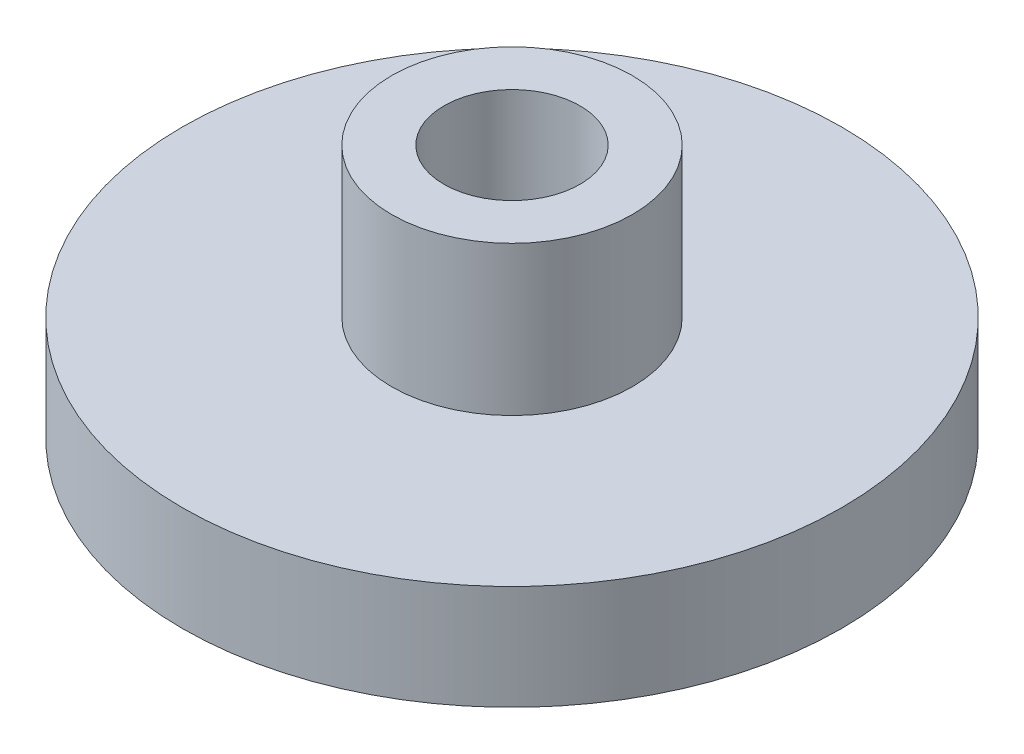
ISO-10303-21;
HEADER;
FILE_DESCRIPTION(('STEP AP214'),'2;1');
FILE_NAME('part.step','',(''),(''),'','','');
FILE_SCHEMA(('AUTOMOTIVE_DESIGN { 1 0 10303 214 1 1 1 1 }'));
ENDSEC;
DATA;
#1=APPLICATION_CONTEXT('core data for automotive mechanical design processes');
#2=APPLICATION_PROTOCOL_DEFINITION('international standard','automotive_design',2000,#1);
#3=PRODUCT_CONTEXT('',#1,'mechanical');
#4=PRODUCT('Part','Part','',(#3));
#5=PRODUCT_RELATED_PRODUCT_CATEGORY('part','',(#4));
#6=PRODUCT_DEFINITION_FORMATION('','',#4);
#7=PRODUCT_DEFINITION_CONTEXT('part definition',#1,'design');
#8=PRODUCT_DEFINITION('design','',#6,#7);
#9=PRODUCT_DEFINITION_SHAPE('','',#8);
#10=(LENGTH_UNIT() NAMED_UNIT(*) SI_UNIT(.MILLI.,.METRE.));
#11=(NAMED_UNIT(*) PLANE_ANGLE_UNIT() SI_UNIT($,.RADIAN.));
#12=(NAMED_UNIT(*) SI_UNIT($,.STERADIAN.) SOLID_ANGLE_UNIT());
#13=UNCERTAINTY_MEASURE_WITH_UNIT(LENGTH_MEASURE(1.E-05),#10,'distance_accuracy_value','');
#14=(GEOMETRIC_REPRESENTATION_CONTEXT(3) GLOBAL_UNCERTAINTY_ASSIGNED_CONTEXT((#13)) GLOBAL_UNIT_ASSIGNED_CONTEXT((#10,
#11,#12)) REPRESENTATION_CONTEXT('',''));
#15=CARTESIAN_POINT('',(0.,0.,0.));
#16=DIRECTION('',(0.,0.,1.));
#17=DIRECTION('',(1.,0.,0.));
#18=AXIS2_PLACEMENT_3D('',#15,#16,#17);
#19=CARTESIAN_POINT('',(40.005,0.,0.));
#20=DIRECTION('',(0.,1.,0.));
#21=DIRECTION('',(0.,0.,1.));
#22=AXIS2_PLACEMENT_3D('',#19,#20,#21);
#23=PLANE('',#22);
#24=CARTESIAN_POINT('',(0.,0.,0.));
#25=DIRECTION('',(0.,1.,0.));
#26=DIRECTION('',(0.,0.,1.));
#27=AXIS2_PLACEMENT_3D('',#24,#25,#26);
#28=CIRCLE('',#27,40.005);
#29=CARTESIAN_POINT('',(0.,0.,40.005));
#30=VERTEX_POINT('',#29);
#31=EDGE_CURVE('E55',#30,#30,#28,.T.);
#32=ORIENTED_EDGE('',*,*,#31,.F.);
#33=EDGE_LOOP('',(#32));
#34=FACE_BOUND('',#33,.T.);
#35=CARTESIAN_POINT('',(0.,0.,0.));
#36=DIRECTION('',(0.,1.,0.));
#37=DIRECTION('',(0.,0.,1.));
#38=AXIS2_PLACEMENT_3D('',#35,#36,#37);
#39=CIRCLE('',#38,8.255);
#40=CARTESIAN_POINT('',(0.,0.,8.255));
#41=VERTEX_POINT('',#40);
#42=EDGE_CURVE('E10',#41,#41,#39,.T.);
#43=ORIENTED_EDGE('',*,*,#42,.T.);
#44=EDGE_LOOP('',(#43));
#45=FACE_BOUND('',#44,.T.);
#46=ADVANCED_FACE('F33',(#34,#45),#23,.F.);
#47=CARTESIAN_POINT('',(0.,47.9158916056349,0.));
#48=DIRECTION('',(0.,1.,0.));
#49=DIRECTION('',(0.,0.,1.));
#50=AXIS2_PLACEMENT_3D('',#47,#48,#49);
#51=CYLINDRICAL_SURFACE('',#50,8.255);
#52=ORIENTED_EDGE('',*,*,#42,.F.);
#53=EDGE_LOOP('',(#52));
#54=FACE_BOUND('',#53,.T.);
#55=CARTESIAN_POINT('',(0.,30.80004,0.));
#56=DIRECTION('',(0.,1.,0.));
#57=DIRECTION('',(0.,0.,1.));
#58=AXIS2_PLACEMENT_3D('',#55,#56,#57);
#59=CIRCLE('',#58,8.255);
#60=CARTESIAN_POINT('',(0.,30.80004,8.255));
#61=VERTEX_POINT('',#60);
#62=EDGE_CURVE('E39',#61,#61,#59,.T.);
#63=ORIENTED_EDGE('',*,*,#62,.T.);
#64=EDGE_LOOP('',(#63));
#65=FACE_BOUND('',#64,.T.);
#66=ADVANCED_FACE('F62',(#54,#65),#51,.F.);
#67=CARTESIAN_POINT('',(8.255,30.80004,0.));
#68=DIRECTION('',(0.,-1.,0.));
#69=DIRECTION('',(0.,0.,-1.));
#70=AXIS2_PLACEMENT_3D('',#67,#68,#69);
#71=PLANE('',#70);
#72=ORIENTED_EDGE('',*,*,#62,.F.);
#73=EDGE_LOOP('',(#72));
#74=FACE_BOUND('',#73,.T.);
#75=CARTESIAN_POINT('',(0.,30.80004,0.));
#76=DIRECTION('',(0.,1.,0.));
#77=DIRECTION('',(0.,0.,1.));
#78=AXIS2_PLACEMENT_3D('',#75,#76,#77);
#79=CIRCLE('',#78,14.605);
#80=CARTESIAN_POINT('',(0.,30.80004,14.605));
#81=VERTEX_POINT('',#80);
#82=EDGE_CURVE('E43',#81,#81,#79,.T.);
#83=ORIENTED_EDGE('',*,*,#82,.T.);
#84=EDGE_LOOP('',(#83));
#85=FACE_BOUND('',#84,.T.);
#86=ADVANCED_FACE('F66',(#74,#85),#71,.F.);
#87=CARTESIAN_POINT('',(0.,47.9158916056349,0.));
#88=DIRECTION('',(0.,1.,0.));
#89=DIRECTION('',(0.,0.,1.));
#90=AXIS2_PLACEMENT_3D('',#87,#88,#89);
#91=CYLINDRICAL_SURFACE('',#90,14.605);
#92=ORIENTED_EDGE('',*,*,#82,.F.);
#93=EDGE_LOOP('',(#92));
#94=FACE_BOUND('',#93,.T.);
#95=CARTESIAN_POINT('',(0.,12.7,0.));
#96=DIRECTION('',(0.,1.,0.));
#97=DIRECTION('',(0.,0.,1.));
#98=AXIS2_PLACEMENT_3D('',#95,#96,#97);
#99=CIRCLE('',#98,14.605);
#100=CARTESIAN_POINT('',(0.,12.7,14.605));
#101=VERTEX_POINT('',#100);
#102=EDGE_CURVE('E47',#101,#101,#99,.T.);
#103=ORIENTED_EDGE('',*,*,#102,.T.);
#104=EDGE_LOOP('',(#103));
#105=FACE_BOUND('',#104,.T.);
#106=ADVANCED_FACE('F71',(#94,#105),#91,.T.);
#107=CARTESIAN_POINT('',(14.605,12.7,0.));
#108=DIRECTION('',(0.,-1.,0.));
#109=DIRECTION('',(0.,0.,-1.));
#110=AXIS2_PLACEMENT_3D('',#107,#108,#109);
#111=PLANE('',#110);
#112=ORIENTED_EDGE('',*,*,#102,.F.);
#113=EDGE_LOOP('',(#112));
#114=FACE_BOUND('',#113,.T.);
#115=CARTESIAN_POINT('',(0.,12.7,0.));
#116=DIRECTION('',(0.,1.,0.));
#117=DIRECTION('',(0.,0.,1.));
#118=AXIS2_PLACEMENT_3D('',#115,#116,#117);
#119=CIRCLE('',#118,40.005);
#120=CARTESIAN_POINT('',(0.,12.7,40.005));
#121=VERTEX_POINT('',#120);
#122=EDGE_CURVE('E52',#121,#121,#119,.T.);
#123=ORIENTED_EDGE('',*,*,#122,.T.);
#124=EDGE_LOOP('',(#123));
#125=FACE_BOUND('',#124,.T.);
#126=ADVANCED_FACE('F77',(#114,#125),#111,.F.);
#127=CARTESIAN_POINT('',(0.,47.9158916056349,0.));
#128=DIRECTION('',(0.,1.,0.));
#129=DIRECTION('',(0.,0.,1.));
#130=AXIS2_PLACEMENT_3D('',#127,#128,#129);
#131=CYLINDRICAL_SURFACE('',#130,40.005);
#132=ORIENTED_EDGE('',*,*,#122,.F.);
#133=EDGE_LOOP('',(#132));
#134=FACE_BOUND('',#133,.T.);
#135=ORIENTED_EDGE('',*,*,#31,.T.);
#136=EDGE_LOOP('',(#135));
#137=FACE_BOUND('',#136,.T.);
#138=ADVANCED_FACE('F59',(#134,#137),#131,.T.);
#139=CLOSED_SHELL('',(#46,#66,#86,#106,#126,#138));
#140=MANIFOLD_SOLID_BREP('B2',#139);
#141=ADVANCED_BREP_SHAPE_REPRESENTATION('',(#18,#140),#14);
#142=SHAPE_DEFINITION_REPRESENTATION(#9,#141);
ENDSEC;
END-ISO-10303-21;
